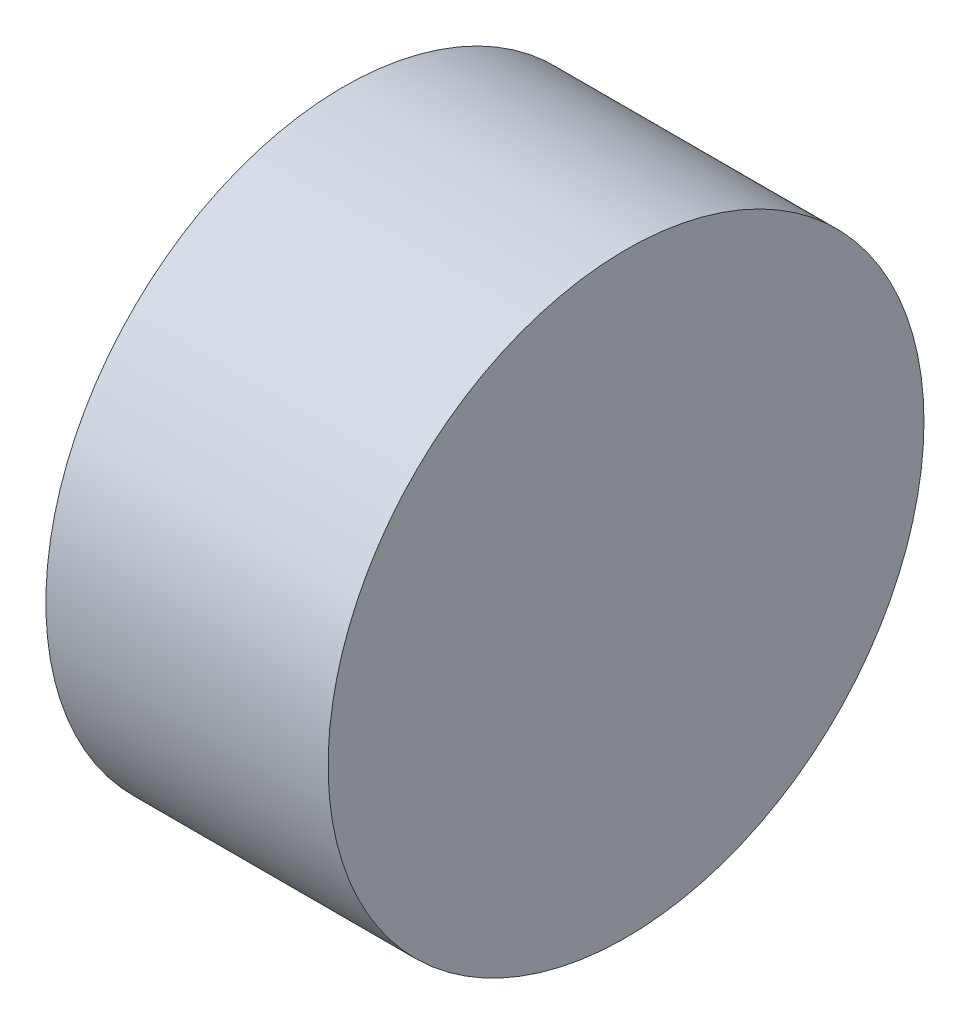
ISO-10303-21;
HEADER;
FILE_DESCRIPTION(('STEP AP214'),'2;1');
FILE_NAME('part.step','',(''),(''),'','','');
FILE_SCHEMA(('AUTOMOTIVE_DESIGN { 1 0 10303 214 1 1 1 1 }'));
ENDSEC;
DATA;
#1=APPLICATION_CONTEXT('core data for automotive mechanical design processes');
#2=APPLICATION_PROTOCOL_DEFINITION('international standard','automotive_design',2000,#1);
#3=PRODUCT_CONTEXT('',#1,'mechanical');
#4=PRODUCT('Part','Part','',(#3));
#5=PRODUCT_RELATED_PRODUCT_CATEGORY('part','',(#4));
#6=PRODUCT_DEFINITION_FORMATION('','',#4);
#7=PRODUCT_DEFINITION_CONTEXT('part definition',#1,'design');
#8=PRODUCT_DEFINITION('design','',#6,#7);
#9=PRODUCT_DEFINITION_SHAPE('','',#8);
#10=(LENGTH_UNIT() NAMED_UNIT(*) SI_UNIT(.MILLI.,.METRE.));
#11=(NAMED_UNIT(*) PLANE_ANGLE_UNIT() SI_UNIT($,.RADIAN.));
#12=(NAMED_UNIT(*) SI_UNIT($,.STERADIAN.) SOLID_ANGLE_UNIT());
#13=UNCERTAINTY_MEASURE_WITH_UNIT(LENGTH_MEASURE(1.E-05),#10,'distance_accuracy_value','');
#14=(GEOMETRIC_REPRESENTATION_CONTEXT(3) GLOBAL_UNCERTAINTY_ASSIGNED_CONTEXT((#13)) GLOBAL_UNIT_ASSIGNED_CONTEXT((#10,
#11,#12)) REPRESENTATION_CONTEXT('',''));
#15=CARTESIAN_POINT('',(0.,0.,0.));
#16=DIRECTION('',(0.,0.,1.));
#17=DIRECTION('',(1.,0.,0.));
#18=AXIS2_PLACEMENT_3D('',#15,#16,#17);
#19=CARTESIAN_POINT('',(0.036,0.,0.));
#20=DIRECTION('',(-1.,0.,0.));
#21=DIRECTION('',(0.,0.,1.));
#22=AXIS2_PLACEMENT_3D('',#19,#20,#21);
#23=CYLINDRICAL_SURFACE('',#22,0.038);
#24=CARTESIAN_POINT('',(0.036,0.,0.));
#25=DIRECTION('',(1.,0.,0.));
#26=DIRECTION('',(0.,0.,-1.));
#27=AXIS2_PLACEMENT_3D('',#24,#25,#26);
#28=CIRCLE('',#27,0.038);
#29=CARTESIAN_POINT('',(0.036,0.,-0.038));
#30=VERTEX_POINT('',#29);
#31=EDGE_CURVE('E10',#30,#30,#28,.T.);
#32=ORIENTED_EDGE('',*,*,#31,.F.);
#33=EDGE_LOOP('',(#32));
#34=FACE_BOUND('',#33,.T.);
#35=CARTESIAN_POINT('',(0.,0.,0.));
#36=DIRECTION('',(1.,0.,0.));
#37=DIRECTION('',(0.,0.,-1.));
#38=AXIS2_PLACEMENT_3D('',#35,#36,#37);
#39=CIRCLE('',#38,0.038);
#40=CARTESIAN_POINT('',(0.,0.,-0.038));
#41=VERTEX_POINT('',#40);
#42=EDGE_CURVE('E36',#41,#41,#39,.T.);
#43=ORIENTED_EDGE('',*,*,#42,.T.);
#44=EDGE_LOOP('',(#43));
#45=FACE_BOUND('',#44,.T.);
#46=ADVANCED_FACE('F33',(#34,#45),#23,.T.);
#47=CARTESIAN_POINT('',(0.036,0.,0.));
#48=DIRECTION('',(1.,0.,0.));
#49=DIRECTION('',(0.,0.,-1.));
#50=AXIS2_PLACEMENT_3D('',#47,#48,#49);
#51=PLANE('',#50);
#52=ORIENTED_EDGE('',*,*,#31,.T.);
#53=EDGE_LOOP('',(#52));
#54=FACE_BOUND('',#53,.T.);
#55=ADVANCED_FACE('F48',(#54),#51,.T.);
#56=CARTESIAN_POINT('',(0.,0.,0.));
#57=DIRECTION('',(1.,0.,0.));
#58=DIRECTION('',(0.,0.,-1.));
#59=AXIS2_PLACEMENT_3D('',#56,#57,#58);
#60=PLANE('',#59);
#61=ORIENTED_EDGE('',*,*,#42,.F.);
#62=EDGE_LOOP('',(#61));
#63=FACE_BOUND('',#62,.T.);
#64=ADVANCED_FACE('F46',(#63),#60,.F.);
#65=CLOSED_SHELL('',(#46,#55,#64));
#66=MANIFOLD_SOLID_BREP('B2',#65);
#67=ADVANCED_BREP_SHAPE_REPRESENTATION('',(#18,#66),#14);
#68=SHAPE_DEFINITION_REPRESENTATION(#9,#67);
ENDSEC;
END-ISO-10303-21;
